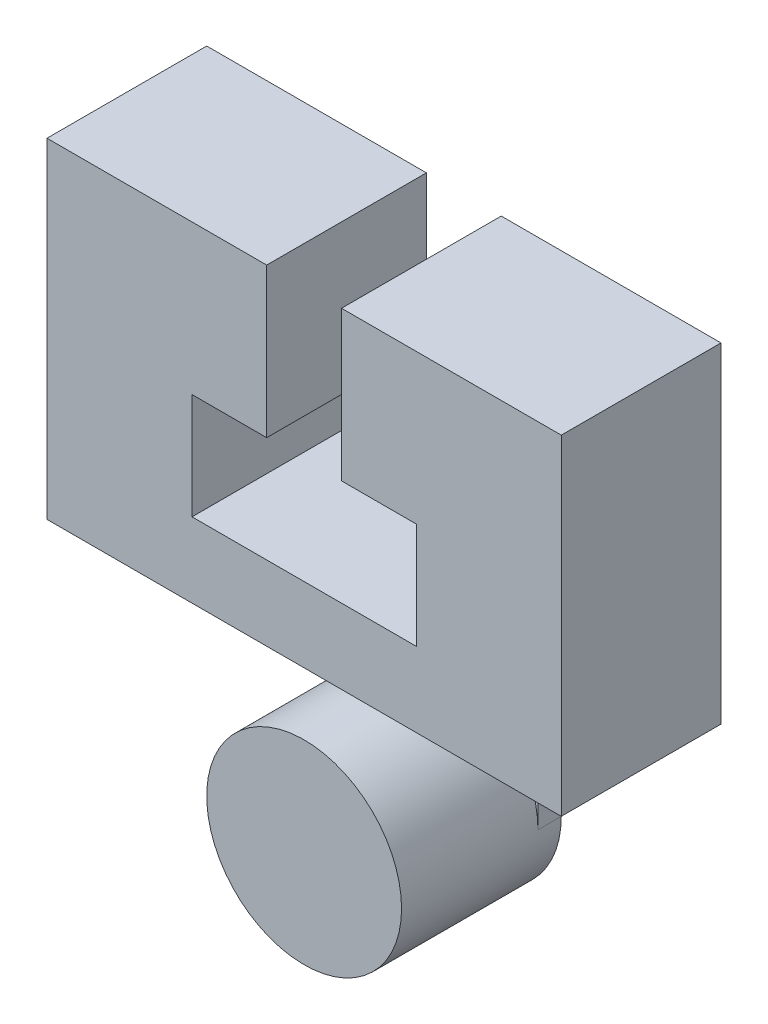
ISO-10303-21;
HEADER;
FILE_DESCRIPTION(('STEP AP214'),'2;1');
FILE_NAME('part.step','',(''),(''),'','','');
FILE_SCHEMA(('AUTOMOTIVE_DESIGN { 1 0 10303 214 1 1 1 1 }'));
ENDSEC;
DATA;
#1=APPLICATION_CONTEXT('core data for automotive mechanical design processes');
#2=APPLICATION_PROTOCOL_DEFINITION('international standard','automotive_design',2000,#1);
#3=PRODUCT_CONTEXT('',#1,'mechanical');
#4=PRODUCT('Part','Part','',(#3));
#5=PRODUCT_RELATED_PRODUCT_CATEGORY('part','',(#4));
#6=PRODUCT_DEFINITION_FORMATION('','',#4);
#7=PRODUCT_DEFINITION_CONTEXT('part definition',#1,'design');
#8=PRODUCT_DEFINITION('design','',#6,#7);
#9=PRODUCT_DEFINITION_SHAPE('','',#8);
#10=(LENGTH_UNIT() NAMED_UNIT(*) SI_UNIT(.MILLI.,.METRE.));
#11=(NAMED_UNIT(*) PLANE_ANGLE_UNIT() SI_UNIT($,.RADIAN.));
#12=(NAMED_UNIT(*) SI_UNIT($,.STERADIAN.) SOLID_ANGLE_UNIT());
#13=UNCERTAINTY_MEASURE_WITH_UNIT(LENGTH_MEASURE(1.E-05),#10,'distance_accuracy_value','');
#14=(GEOMETRIC_REPRESENTATION_CONTEXT(3) GLOBAL_UNCERTAINTY_ASSIGNED_CONTEXT((#13)) GLOBAL_UNIT_ASSIGNED_CONTEXT((#10,
#11,#12)) REPRESENTATION_CONTEXT('',''));
#15=CARTESIAN_POINT('',(0.,0.,0.));
#16=DIRECTION('',(0.,0.,1.));
#17=DIRECTION('',(1.,0.,0.));
#18=AXIS2_PLACEMENT_3D('',#15,#16,#17);
#19=CARTESIAN_POINT('',(40.894,77.9018,97.189073188502));
#20=DIRECTION('',(0.,1.,0.));
#21=DIRECTION('',(0.,0.,1.));
#22=AXIS2_PLACEMENT_3D('',#19,#20,#21);
#23=PLANE('',#22);
#24=DIRECTION('',(0.,0.,-1.));
#25=VECTOR('',#24,1.);
#26=CARTESIAN_POINT('',(-5.9554872,77.9018,0.));
#27=LINE('',#26,#25);
#28=CARTESIAN_POINT('',(-5.9554872,77.9018,0.));
#29=VERTEX_POINT('',#28);
#30=CARTESIAN_POINT('',(-5.9554872,77.9018,-25.4));
#31=VERTEX_POINT('',#30);
#32=EDGE_CURVE('E223',#29,#31,#27,.T.);
#33=ORIENTED_EDGE('',*,*,#32,.T.);
#34=DIRECTION('',(1.,0.,0.));
#35=VECTOR('',#34,1.);
#36=CARTESIAN_POINT('',(40.894,77.9018,-25.4));
#37=LINE('',#36,#35);
#38=CARTESIAN_POINT('',(-40.894,77.9018,-25.4));
#39=VERTEX_POINT('',#38);
#40=EDGE_CURVE('E245',#39,#31,#37,.T.);
#41=ORIENTED_EDGE('',*,*,#40,.F.);
#42=DIRECTION('',(0.,0.,-1.));
#43=VECTOR('',#42,1.);
#44=CARTESIAN_POINT('',(-40.894,77.9018,97.189073188502));
#45=LINE('',#44,#43);
#46=CARTESIAN_POINT('',(-40.894,77.9018,0.));
#47=VERTEX_POINT('',#46);
#48=EDGE_CURVE('E253',#47,#39,#45,.T.);
#49=ORIENTED_EDGE('',*,*,#48,.F.);
#50=DIRECTION('',(1.,0.,0.));
#51=VECTOR('',#50,1.);
#52=CARTESIAN_POINT('',(40.894,77.9018,0.));
#53=LINE('',#52,#51);
#54=EDGE_CURVE('E263',#47,#29,#53,.T.);
#55=ORIENTED_EDGE('',*,*,#54,.T.);
#56=EDGE_LOOP('',(#33,#41,#49,#55));
#57=FACE_BOUND('',#56,.T.);
#58=ADVANCED_FACE('F57',(#57),#23,.T.);
#59=CARTESIAN_POINT('',(0.,0.,-25.4));
#60=DIRECTION('',(0.,0.,1.));
#61=DIRECTION('',(1.,0.,0.));
#62=AXIS2_PLACEMENT_3D('',#59,#60,#61);
#63=CYLINDRICAL_SURFACE('',#62,15.494);
#64=DIRECTION('',(0.,0.,-1.));
#65=VECTOR('',#64,1.);
#66=CARTESIAN_POINT('',(15.494,0.,-21.6916));
#67=LINE('',#66,#65);
#68=CARTESIAN_POINT('',(15.494,0.,-21.6916));
#69=VERTEX_POINT('',#68);
#70=CARTESIAN_POINT('',(15.494,0.,-25.4));
#71=VERTEX_POINT('',#70);
#72=EDGE_CURVE('E289',#69,#71,#67,.T.);
#73=ORIENTED_EDGE('',*,*,#72,.F.);
#74=CARTESIAN_POINT('',(0.,0.,-21.6916));
#75=DIRECTION('',(0.,0.,1.));
#76=DIRECTION('',(-1.,0.,0.));
#77=AXIS2_PLACEMENT_3D('',#74,#75,#76);
#78=CIRCLE('',#77,15.494);
#79=CARTESIAN_POINT('',(-15.494,0.,-21.6916));
#80=VERTEX_POINT('',#79);
#81=EDGE_CURVE('E80',#69,#80,#78,.T.);
#82=ORIENTED_EDGE('',*,*,#81,.T.);
#83=DIRECTION('',(0.,0.,-1.));
#84=VECTOR('',#83,1.);
#85=CARTESIAN_POINT('',(-15.494,0.,-21.6916));
#86=LINE('',#85,#84);
#87=CARTESIAN_POINT('',(-15.494,0.,-25.4));
#88=VERTEX_POINT('',#87);
#89=EDGE_CURVE('E284',#80,#88,#86,.T.);
#90=ORIENTED_EDGE('',*,*,#89,.T.);
#91=CARTESIAN_POINT('',(0.,0.,-25.4));
#92=DIRECTION('',(0.,0.,1.));
#93=DIRECTION('',(1.,0.,0.));
#94=AXIS2_PLACEMENT_3D('',#91,#92,#93);
#95=CIRCLE('',#94,15.494);
#96=EDGE_CURVE('E13',#88,#71,#95,.T.);
#97=ORIENTED_EDGE('',*,*,#96,.T.);
#98=EDGE_LOOP('',(#73,#82,#90,#97));
#99=FACE_BOUND('',#98,.T.);
#100=CARTESIAN_POINT('',(0.,0.,0.));
#101=DIRECTION('',(0.,0.,1.));
#102=DIRECTION('',(1.,0.,0.));
#103=AXIS2_PLACEMENT_3D('',#100,#101,#102);
#104=CIRCLE('',#103,15.494);
#105=CARTESIAN_POINT('',(15.494,0.,0.));
#106=VERTEX_POINT('',#105);
#107=EDGE_CURVE('E61',#106,#106,#104,.T.);
#108=ORIENTED_EDGE('',*,*,#107,.F.);
#109=EDGE_LOOP('',(#108));
#110=FACE_BOUND('',#109,.T.);
#111=ADVANCED_FACE('F59',(#99,#110),#63,.T.);
#112=CARTESIAN_POINT('',(0.,0.,-25.4));
#113=DIRECTION('',(0.,0.,1.));
#114=DIRECTION('',(1.,0.,0.));
#115=AXIS2_PLACEMENT_3D('',#112,#113,#114);
#116=PLANE('',#115);
#117=ORIENTED_EDGE('',*,*,#40,.T.);
#118=DIRECTION('',(0.,1.,0.));
#119=VECTOR('',#118,1.);
#120=CARTESIAN_POINT('',(-5.9554872,54.1274,-25.4));
#121=LINE('',#120,#119);
#122=CARTESIAN_POINT('',(-5.9554872,54.1274,-25.4));
#123=VERTEX_POINT('',#122);
#124=EDGE_CURVE('E192',#123,#31,#121,.T.);
#125=ORIENTED_EDGE('',*,*,#124,.F.);
#126=DIRECTION('',(1.,0.,0.));
#127=VECTOR('',#126,1.);
#128=CARTESIAN_POINT('',(-17.8308,54.1274,-25.4));
#129=LINE('',#128,#127);
#130=CARTESIAN_POINT('',(-17.8308,54.1274,-25.4));
#131=VERTEX_POINT('',#130);
#132=EDGE_CURVE('E194',#131,#123,#129,.T.);
#133=ORIENTED_EDGE('',*,*,#132,.F.);
#134=DIRECTION('',(0.,1.,0.));
#135=VECTOR('',#134,1.);
#136=CARTESIAN_POINT('',(-17.8308,37.2872,-25.4));
#137=LINE('',#136,#135);
#138=CARTESIAN_POINT('',(-17.8308,37.2872,-25.4));
#139=VERTEX_POINT('',#138);
#140=EDGE_CURVE('E218',#139,#131,#137,.T.);
#141=ORIENTED_EDGE('',*,*,#140,.F.);
#142=DIRECTION('',(-1.,0.,0.));
#143=VECTOR('',#142,1.);
#144=CARTESIAN_POINT('',(17.8308,37.2872,-25.4));
#145=LINE('',#144,#143);
#146=CARTESIAN_POINT('',(17.8308,37.2872,-25.4));
#147=VERTEX_POINT('',#146);
#148=EDGE_CURVE('E215',#147,#139,#145,.T.);
#149=ORIENTED_EDGE('',*,*,#148,.F.);
#150=DIRECTION('',(0.,-1.,0.));
#151=VECTOR('',#150,1.);
#152=CARTESIAN_POINT('',(17.8308,54.1274,-25.4));
#153=LINE('',#152,#151);
#154=CARTESIAN_POINT('',(17.8308,54.1274,-25.4));
#155=VERTEX_POINT('',#154);
#156=EDGE_CURVE('E212',#155,#147,#153,.T.);
#157=ORIENTED_EDGE('',*,*,#156,.F.);
#158=DIRECTION('',(1.,0.,0.));
#159=VECTOR('',#158,1.);
#160=CARTESIAN_POINT('',(5.94478872,54.1274,-25.4));
#161=LINE('',#160,#159);
#162=CARTESIAN_POINT('',(5.94478872,54.1274,-25.4));
#163=VERTEX_POINT('',#162);
#164=EDGE_CURVE('E210',#163,#155,#161,.T.);
#165=ORIENTED_EDGE('',*,*,#164,.F.);
#166=DIRECTION('',(0.,-1.,0.));
#167=VECTOR('',#166,1.);
#168=CARTESIAN_POINT('',(5.94478872,77.9018,-25.4));
#169=LINE('',#168,#167);
#170=CARTESIAN_POINT('',(5.94478872,77.9018,-25.4));
#171=VERTEX_POINT('',#170);
#172=EDGE_CURVE('E172',#171,#163,#169,.T.);
#173=ORIENTED_EDGE('',*,*,#172,.F.);
#174=CARTESIAN_POINT('',(40.894,77.9018,-25.4));
#175=VERTEX_POINT('',#174);
#176=EDGE_CURVE('E248',#171,#175,#37,.T.);
#177=ORIENTED_EDGE('',*,*,#176,.T.);
#178=DIRECTION('',(0.,-1.,0.));
#179=VECTOR('',#178,1.);
#180=CARTESIAN_POINT('',(40.894,25.4,-25.4));
#181=LINE('',#180,#179);
#182=CARTESIAN_POINT('',(40.894,25.4,-25.4));
#183=VERTEX_POINT('',#182);
#184=EDGE_CURVE('E241',#175,#183,#181,.T.);
#185=ORIENTED_EDGE('',*,*,#184,.T.);
#186=DIRECTION('',(-1.,0.,0.));
#187=VECTOR('',#186,1.);
#188=CARTESIAN_POINT('',(15.494,25.4,-25.4));
#189=LINE('',#188,#187);
#190=CARTESIAN_POINT('',(15.494,25.4,-25.4));
#191=VERTEX_POINT('',#190);
#192=EDGE_CURVE('E237',#183,#191,#189,.T.);
#193=ORIENTED_EDGE('',*,*,#192,.T.);
#194=DIRECTION('',(0.,-1.,0.));
#195=VECTOR('',#194,1.);
#196=CARTESIAN_POINT('',(15.494,0.,-25.4));
#197=LINE('',#196,#195);
#198=EDGE_CURVE('E275',#191,#71,#197,.T.);
#199=ORIENTED_EDGE('',*,*,#198,.T.);
#200=ORIENTED_EDGE('',*,*,#96,.F.);
#201=DIRECTION('',(0.,1.,0.));
#202=VECTOR('',#201,1.);
#203=CARTESIAN_POINT('',(-15.494,25.4,-25.4));
#204=LINE('',#203,#202);
#205=CARTESIAN_POINT('',(-15.494,25.4,-25.4));
#206=VERTEX_POINT('',#205);
#207=EDGE_CURVE('E272',#88,#206,#204,.T.);
#208=ORIENTED_EDGE('',*,*,#207,.T.);
#209=CARTESIAN_POINT('',(-40.894,25.4,-25.4));
#210=VERTEX_POINT('',#209);
#211=EDGE_CURVE('E226',#206,#210,#189,.T.);
#212=ORIENTED_EDGE('',*,*,#211,.T.);
#213=DIRECTION('',(0.,1.,0.));
#214=VECTOR('',#213,1.);
#215=CARTESIAN_POINT('',(-40.894,77.9018,-25.4));
#216=LINE('',#215,#214);
#217=EDGE_CURVE('E240',#210,#39,#216,.T.);
#218=ORIENTED_EDGE('',*,*,#217,.T.);
#219=EDGE_LOOP('',(#117,#125,#133,#141,#149,#157,#165,#173,#177,#185,#193,#199,#200,#208,#212,#218));
#220=FACE_BOUND('',#219,.T.);
#221=ADVANCED_FACE('F305',(#220),#116,.F.);
#222=CARTESIAN_POINT('',(0.,0.,0.));
#223=DIRECTION('',(0.,0.,1.));
#224=DIRECTION('',(1.,0.,0.));
#225=AXIS2_PLACEMENT_3D('',#222,#223,#224);
#226=PLANE('',#225);
#227=ORIENTED_EDGE('',*,*,#107,.T.);
#228=EDGE_LOOP('',(#227));
#229=FACE_BOUND('',#228,.T.);
#230=ADVANCED_FACE('F383',(#229),#226,.T.);
#231=CARTESIAN_POINT('',(15.494,0.,-21.6916));
#232=DIRECTION('',(1.,0.,0.));
#233=DIRECTION('',(0.,0.,-1.));
#234=AXIS2_PLACEMENT_3D('',#231,#232,#233);
#235=PLANE('',#234);
#236=ORIENTED_EDGE('',*,*,#198,.F.);
#237=DIRECTION('',(0.,0.,-1.));
#238=VECTOR('',#237,1.);
#239=CARTESIAN_POINT('',(15.494,25.4,-21.6916));
#240=LINE('',#239,#238);
#241=CARTESIAN_POINT('',(15.494,25.4,-21.6916));
#242=VERTEX_POINT('',#241);
#243=EDGE_CURVE('E292',#242,#191,#240,.T.);
#244=ORIENTED_EDGE('',*,*,#243,.F.);
#245=DIRECTION('',(0.,-1.,0.));
#246=VECTOR('',#245,1.);
#247=CARTESIAN_POINT('',(15.494,0.,-21.6916));
#248=LINE('',#247,#246);
#249=EDGE_CURVE('E281',#242,#69,#248,.T.);
#250=ORIENTED_EDGE('',*,*,#249,.T.);
#251=ORIENTED_EDGE('',*,*,#72,.T.);
#252=EDGE_LOOP('',(#236,#244,#250,#251));
#253=FACE_BOUND('',#252,.T.);
#254=ADVANCED_FACE('F345',(#253),#235,.T.);
#255=CARTESIAN_POINT('',(-15.494,25.4,-21.6916));
#256=DIRECTION('',(-1.,0.,0.));
#257=DIRECTION('',(0.,0.,1.));
#258=AXIS2_PLACEMENT_3D('',#255,#256,#257);
#259=PLANE('',#258);
#260=ORIENTED_EDGE('',*,*,#207,.F.);
#261=ORIENTED_EDGE('',*,*,#89,.F.);
#262=DIRECTION('',(0.,1.,0.));
#263=VECTOR('',#262,1.);
#264=CARTESIAN_POINT('',(-15.494,25.4,-21.6916));
#265=LINE('',#264,#263);
#266=CARTESIAN_POINT('',(-15.494,25.4,-21.6916));
#267=VERTEX_POINT('',#266);
#268=EDGE_CURVE('E274',#80,#267,#265,.T.);
#269=ORIENTED_EDGE('',*,*,#268,.T.);
#270=DIRECTION('',(0.,0.,-1.));
#271=VECTOR('',#270,1.);
#272=CARTESIAN_POINT('',(-15.494,25.4,-21.6916));
#273=LINE('',#272,#271);
#274=EDGE_CURVE('E295',#267,#206,#273,.T.);
#275=ORIENTED_EDGE('',*,*,#274,.T.);
#276=EDGE_LOOP('',(#260,#261,#269,#275));
#277=FACE_BOUND('',#276,.T.);
#278=ADVANCED_FACE('F301',(#277),#259,.T.);
#279=CARTESIAN_POINT('',(0.,0.,-21.6916));
#280=DIRECTION('',(0.,0.,-1.));
#281=DIRECTION('',(-1.,0.,0.));
#282=AXIS2_PLACEMENT_3D('',#279,#280,#281);
#283=PLANE('',#282);
#284=ORIENTED_EDGE('',*,*,#81,.F.);
#285=ORIENTED_EDGE('',*,*,#249,.F.);
#286=DIRECTION('',(1.,0.,0.));
#287=VECTOR('',#286,1.);
#288=CARTESIAN_POINT('',(15.494,25.4,-21.6916));
#289=LINE('',#288,#287);
#290=EDGE_CURVE('E278',#267,#242,#289,.T.);
#291=ORIENTED_EDGE('',*,*,#290,.F.);
#292=ORIENTED_EDGE('',*,*,#268,.F.);
#293=EDGE_LOOP('',(#284,#285,#291,#292));
#294=FACE_BOUND('',#293,.T.);
#295=ADVANCED_FACE('F347',(#294),#283,.F.);
#296=CARTESIAN_POINT('',(15.494,25.4,97.189073188502));
#297=DIRECTION('',(0.,-1.,0.));
#298=DIRECTION('',(0.,0.,-1.));
#299=AXIS2_PLACEMENT_3D('',#296,#297,#298);
#300=PLANE('',#299);
#301=ORIENTED_EDGE('',*,*,#274,.F.);
#302=ORIENTED_EDGE('',*,*,#290,.T.);
#303=ORIENTED_EDGE('',*,*,#243,.T.);
#304=ORIENTED_EDGE('',*,*,#192,.F.);
#305=DIRECTION('',(0.,0.,-1.));
#306=VECTOR('',#305,1.);
#307=CARTESIAN_POINT('',(40.894,25.4,97.189073188502));
#308=LINE('',#307,#306);
#309=CARTESIAN_POINT('',(40.894,25.4,0.));
#310=VERTEX_POINT('',#309);
#311=EDGE_CURVE('E258',#310,#183,#308,.T.);
#312=ORIENTED_EDGE('',*,*,#311,.F.);
#313=DIRECTION('',(-1.,0.,0.));
#314=VECTOR('',#313,1.);
#315=CARTESIAN_POINT('',(15.494,25.4,0.));
#316=LINE('',#315,#314);
#317=CARTESIAN_POINT('',(-40.894,25.4,0.));
#318=VERTEX_POINT('',#317);
#319=EDGE_CURVE('E254',#310,#318,#316,.T.);
#320=ORIENTED_EDGE('',*,*,#319,.T.);
#321=DIRECTION('',(0.,0.,-1.));
#322=VECTOR('',#321,1.);
#323=CARTESIAN_POINT('',(-40.894,25.4,97.189073188502));
#324=LINE('',#323,#322);
#325=EDGE_CURVE('E257',#318,#210,#324,.T.);
#326=ORIENTED_EDGE('',*,*,#325,.T.);
#327=ORIENTED_EDGE('',*,*,#211,.F.);
#328=EDGE_LOOP('',(#301,#302,#303,#304,#312,#320,#326,#327));
#329=FACE_BOUND('',#328,.T.);
#330=ADVANCED_FACE('F307',(#329),#300,.T.);
#331=CARTESIAN_POINT('',(0.,0.,0.));
#332=DIRECTION('',(0.,0.,1.));
#333=DIRECTION('',(1.,0.,0.));
#334=AXIS2_PLACEMENT_3D('',#331,#332,#333);
#335=PLANE('',#334);
#336=DIRECTION('',(0.,1.,0.));
#337=VECTOR('',#336,1.);
#338=CARTESIAN_POINT('',(-5.9554872,54.1274,0.));
#339=LINE('',#338,#337);
#340=CARTESIAN_POINT('',(-5.9554872,54.1274,0.));
#341=VERTEX_POINT('',#340);
#342=EDGE_CURVE('E207',#341,#29,#339,.T.);
#343=ORIENTED_EDGE('',*,*,#342,.T.);
#344=ORIENTED_EDGE('',*,*,#54,.F.);
#345=DIRECTION('',(0.,1.,0.));
#346=VECTOR('',#345,1.);
#347=CARTESIAN_POINT('',(-40.894,77.9018,0.));
#348=LINE('',#347,#346);
#349=EDGE_CURVE('E244',#318,#47,#348,.T.);
#350=ORIENTED_EDGE('',*,*,#349,.F.);
#351=ORIENTED_EDGE('',*,*,#319,.F.);
#352=DIRECTION('',(0.,-1.,0.));
#353=VECTOR('',#352,1.);
#354=CARTESIAN_POINT('',(40.894,25.4,0.));
#355=LINE('',#354,#353);
#356=CARTESIAN_POINT('',(40.894,77.9018,0.));
#357=VERTEX_POINT('',#356);
#358=EDGE_CURVE('E259',#357,#310,#355,.T.);
#359=ORIENTED_EDGE('',*,*,#358,.F.);
#360=CARTESIAN_POINT('',(5.94478872,77.9018,0.));
#361=VERTEX_POINT('',#360);
#362=EDGE_CURVE('E191',#361,#357,#53,.T.);
#363=ORIENTED_EDGE('',*,*,#362,.F.);
#364=DIRECTION('',(0.,-1.,0.));
#365=VECTOR('',#364,1.);
#366=CARTESIAN_POINT('',(5.94478872,77.9018,0.));
#367=LINE('',#366,#365);
#368=CARTESIAN_POINT('',(5.94478872,54.1274,0.));
#369=VERTEX_POINT('',#368);
#370=EDGE_CURVE('E72',#361,#369,#367,.T.);
#371=ORIENTED_EDGE('',*,*,#370,.T.);
#372=DIRECTION('',(1.,0.,0.));
#373=VECTOR('',#372,1.);
#374=CARTESIAN_POINT('',(5.94478872,54.1274,0.));
#375=LINE('',#374,#373);
#376=CARTESIAN_POINT('',(17.8308,54.1274,0.));
#377=VERTEX_POINT('',#376);
#378=EDGE_CURVE('E180',#369,#377,#375,.T.);
#379=ORIENTED_EDGE('',*,*,#378,.T.);
#380=DIRECTION('',(0.,-1.,0.));
#381=VECTOR('',#380,1.);
#382=CARTESIAN_POINT('',(17.8308,54.1274,0.));
#383=LINE('',#382,#381);
#384=CARTESIAN_POINT('',(17.8308,37.2872,0.));
#385=VERTEX_POINT('',#384);
#386=EDGE_CURVE('E185',#377,#385,#383,.T.);
#387=ORIENTED_EDGE('',*,*,#386,.T.);
#388=DIRECTION('',(-1.,0.,0.));
#389=VECTOR('',#388,1.);
#390=CARTESIAN_POINT('',(17.8308,37.2872,0.));
#391=LINE('',#390,#389);
#392=CARTESIAN_POINT('',(-17.8308,37.2872,0.));
#393=VERTEX_POINT('',#392);
#394=EDGE_CURVE('E198',#385,#393,#391,.T.);
#395=ORIENTED_EDGE('',*,*,#394,.T.);
#396=DIRECTION('',(0.,1.,0.));
#397=VECTOR('',#396,1.);
#398=CARTESIAN_POINT('',(-17.8308,37.2872,0.));
#399=LINE('',#398,#397);
#400=CARTESIAN_POINT('',(-17.8308,54.1274,0.));
#401=VERTEX_POINT('',#400);
#402=EDGE_CURVE('E201',#393,#401,#399,.T.);
#403=ORIENTED_EDGE('',*,*,#402,.T.);
#404=DIRECTION('',(1.,0.,0.));
#405=VECTOR('',#404,1.);
#406=CARTESIAN_POINT('',(-17.8308,54.1274,0.));
#407=LINE('',#406,#405);
#408=EDGE_CURVE('E204',#401,#341,#407,.T.);
#409=ORIENTED_EDGE('',*,*,#408,.T.);
#410=EDGE_LOOP('',(#343,#344,#350,#351,#359,#363,#371,#379,#387,#395,#403,#409));
#411=FACE_BOUND('',#410,.T.);
#412=ADVANCED_FACE('F189',(#411),#335,.T.);
#413=CARTESIAN_POINT('',(-40.894,77.9018,97.189073188502));
#414=DIRECTION('',(-1.,0.,0.));
#415=DIRECTION('',(0.,0.,1.));
#416=AXIS2_PLACEMENT_3D('',#413,#414,#415);
#417=PLANE('',#416);
#418=ORIENTED_EDGE('',*,*,#325,.F.);
#419=ORIENTED_EDGE('',*,*,#349,.T.);
#420=ORIENTED_EDGE('',*,*,#48,.T.);
#421=ORIENTED_EDGE('',*,*,#217,.F.);
#422=EDGE_LOOP('',(#418,#419,#420,#421));
#423=FACE_BOUND('',#422,.T.);
#424=ADVANCED_FACE('F312',(#423),#417,.T.);
#425=DIRECTION('',(0.,0.,-1.));
#426=VECTOR('',#425,1.);
#427=CARTESIAN_POINT('',(5.94478872,77.9018,0.));
#428=LINE('',#427,#426);
#429=EDGE_CURVE('E177',#361,#171,#428,.T.);
#430=ORIENTED_EDGE('',*,*,#429,.F.);
#431=ORIENTED_EDGE('',*,*,#362,.T.);
#432=DIRECTION('',(0.,0.,-1.));
#433=VECTOR('',#432,1.);
#434=CARTESIAN_POINT('',(40.894,77.9018,97.189073188502));
#435=LINE('',#434,#433);
#436=EDGE_CURVE('E262',#357,#175,#435,.T.);
#437=ORIENTED_EDGE('',*,*,#436,.T.);
#438=ORIENTED_EDGE('',*,*,#176,.F.);
#439=EDGE_LOOP('',(#430,#431,#437,#438));
#440=FACE_BOUND('',#439,.T.);
#441=ADVANCED_FACE('F337',(#440),#23,.T.);
#442=CARTESIAN_POINT('',(40.894,25.4,97.189073188502));
#443=DIRECTION('',(1.,0.,0.));
#444=DIRECTION('',(0.,0.,-1.));
#445=AXIS2_PLACEMENT_3D('',#442,#443,#444);
#446=PLANE('',#445);
#447=ORIENTED_EDGE('',*,*,#436,.F.);
#448=ORIENTED_EDGE('',*,*,#358,.T.);
#449=ORIENTED_EDGE('',*,*,#311,.T.);
#450=ORIENTED_EDGE('',*,*,#184,.F.);
#451=EDGE_LOOP('',(#447,#448,#449,#450));
#452=FACE_BOUND('',#451,.T.);
#453=ADVANCED_FACE('F341',(#452),#446,.T.);
#454=CARTESIAN_POINT('',(-5.9554872,54.1274,0.));
#455=DIRECTION('',(-1.,0.,0.));
#456=DIRECTION('',(0.,-1.,0.));
#457=AXIS2_PLACEMENT_3D('',#454,#455,#456);
#458=PLANE('',#457);
#459=ORIENTED_EDGE('',*,*,#124,.T.);
#460=ORIENTED_EDGE('',*,*,#32,.F.);
#461=ORIENTED_EDGE('',*,*,#342,.F.);
#462=DIRECTION('',(0.,0.,-1.));
#463=VECTOR('',#462,1.);
#464=CARTESIAN_POINT('',(-5.9554872,54.1274,0.));
#465=LINE('',#464,#463);
#466=EDGE_CURVE('E227',#341,#123,#465,.T.);
#467=ORIENTED_EDGE('',*,*,#466,.T.);
#468=EDGE_LOOP('',(#459,#460,#461,#467));
#469=FACE_BOUND('',#468,.T.);
#470=ADVANCED_FACE('F320',(#469),#458,.F.);
#471=CARTESIAN_POINT('',(-17.8308,54.1274,0.));
#472=DIRECTION('',(0.,1.,0.));
#473=DIRECTION('',(0.,0.,1.));
#474=AXIS2_PLACEMENT_3D('',#471,#472,#473);
#475=PLANE('',#474);
#476=ORIENTED_EDGE('',*,*,#132,.T.);
#477=ORIENTED_EDGE('',*,*,#466,.F.);
#478=ORIENTED_EDGE('',*,*,#408,.F.);
#479=DIRECTION('',(0.,0.,-1.));
#480=VECTOR('',#479,1.);
#481=CARTESIAN_POINT('',(-17.8308,54.1274,0.));
#482=LINE('',#481,#480);
#483=EDGE_CURVE('E229',#401,#131,#482,.T.);
#484=ORIENTED_EDGE('',*,*,#483,.T.);
#485=EDGE_LOOP('',(#476,#477,#478,#484));
#486=FACE_BOUND('',#485,.T.);
#487=ADVANCED_FACE('F324',(#486),#475,.F.);
#488=CARTESIAN_POINT('',(-17.8308,37.2872,0.));
#489=DIRECTION('',(-1.,0.,0.));
#490=DIRECTION('',(0.,-1.,0.));
#491=AXIS2_PLACEMENT_3D('',#488,#489,#490);
#492=PLANE('',#491);
#493=ORIENTED_EDGE('',*,*,#140,.T.);
#494=ORIENTED_EDGE('',*,*,#483,.F.);
#495=ORIENTED_EDGE('',*,*,#402,.F.);
#496=DIRECTION('',(0.,0.,-1.));
#497=VECTOR('',#496,1.);
#498=CARTESIAN_POINT('',(-17.8308,37.2872,0.));
#499=LINE('',#498,#497);
#500=EDGE_CURVE('E231',#393,#139,#499,.T.);
#501=ORIENTED_EDGE('',*,*,#500,.T.);
#502=EDGE_LOOP('',(#493,#494,#495,#501));
#503=FACE_BOUND('',#502,.T.);
#504=ADVANCED_FACE('F329',(#503),#492,.F.);
#505=CARTESIAN_POINT('',(17.8308,37.2872,0.));
#506=DIRECTION('',(0.,-1.,0.));
#507=DIRECTION('',(0.,0.,-1.));
#508=AXIS2_PLACEMENT_3D('',#505,#506,#507);
#509=PLANE('',#508);
#510=ORIENTED_EDGE('',*,*,#148,.T.);
#511=ORIENTED_EDGE('',*,*,#500,.F.);
#512=ORIENTED_EDGE('',*,*,#394,.F.);
#513=DIRECTION('',(0.,0.,-1.));
#514=VECTOR('',#513,1.);
#515=CARTESIAN_POINT('',(17.8308,37.2872,0.));
#516=LINE('',#515,#514);
#517=EDGE_CURVE('E233',#385,#147,#516,.T.);
#518=ORIENTED_EDGE('',*,*,#517,.T.);
#519=EDGE_LOOP('',(#510,#511,#512,#518));
#520=FACE_BOUND('',#519,.T.);
#521=ADVANCED_FACE('F332',(#520),#509,.F.);
#522=CARTESIAN_POINT('',(17.8308,54.1274,0.));
#523=DIRECTION('',(1.,0.,0.));
#524=DIRECTION('',(0.,1.,0.));
#525=AXIS2_PLACEMENT_3D('',#522,#523,#524);
#526=PLANE('',#525);
#527=ORIENTED_EDGE('',*,*,#156,.T.);
#528=ORIENTED_EDGE('',*,*,#517,.F.);
#529=ORIENTED_EDGE('',*,*,#386,.F.);
#530=DIRECTION('',(0.,0.,-1.));
#531=VECTOR('',#530,1.);
#532=CARTESIAN_POINT('',(17.8308,54.1274,0.));
#533=LINE('',#532,#531);
#534=EDGE_CURVE('E176',#377,#155,#533,.T.);
#535=ORIENTED_EDGE('',*,*,#534,.T.);
#536=EDGE_LOOP('',(#527,#528,#529,#535));
#537=FACE_BOUND('',#536,.T.);
#538=ADVANCED_FACE('F334',(#537),#526,.F.);
#539=CARTESIAN_POINT('',(5.94478872,54.1274,0.));
#540=DIRECTION('',(0.,1.,0.));
#541=DIRECTION('',(0.,0.,1.));
#542=AXIS2_PLACEMENT_3D('',#539,#540,#541);
#543=PLANE('',#542);
#544=ORIENTED_EDGE('',*,*,#164,.T.);
#545=ORIENTED_EDGE('',*,*,#534,.F.);
#546=ORIENTED_EDGE('',*,*,#378,.F.);
#547=DIRECTION('',(0.,0.,-1.));
#548=VECTOR('',#547,1.);
#549=CARTESIAN_POINT('',(5.94478872,54.1274,0.));
#550=LINE('',#549,#548);
#551=EDGE_CURVE('E168',#369,#163,#550,.T.);
#552=ORIENTED_EDGE('',*,*,#551,.T.);
#553=EDGE_LOOP('',(#544,#545,#546,#552));
#554=FACE_BOUND('',#553,.T.);
#555=ADVANCED_FACE('F181',(#554),#543,.F.);
#556=CARTESIAN_POINT('',(5.94478872,77.9018,0.));
#557=DIRECTION('',(1.,0.,0.));
#558=DIRECTION('',(0.,1.,0.));
#559=AXIS2_PLACEMENT_3D('',#556,#557,#558);
#560=PLANE('',#559);
#561=ORIENTED_EDGE('',*,*,#172,.T.);
#562=ORIENTED_EDGE('',*,*,#551,.F.);
#563=ORIENTED_EDGE('',*,*,#370,.F.);
#564=ORIENTED_EDGE('',*,*,#429,.T.);
#565=EDGE_LOOP('',(#561,#562,#563,#564));
#566=FACE_BOUND('',#565,.T.);
#567=ADVANCED_FACE('F170',(#566),#560,.F.);
#568=CLOSED_SHELL('',(#58,#111,#221,#230,#254,#278,#295,#330,#412,#424,#441,#453,#470,#487,#504,
#521,#538,#555,#567));
#569=MANIFOLD_SOLID_BREP('B2',#568);
#570=ADVANCED_BREP_SHAPE_REPRESENTATION('',(#18,#569),#14);
#571=SHAPE_DEFINITION_REPRESENTATION(#9,#570);
ENDSEC;
END-ISO-10303-21;
